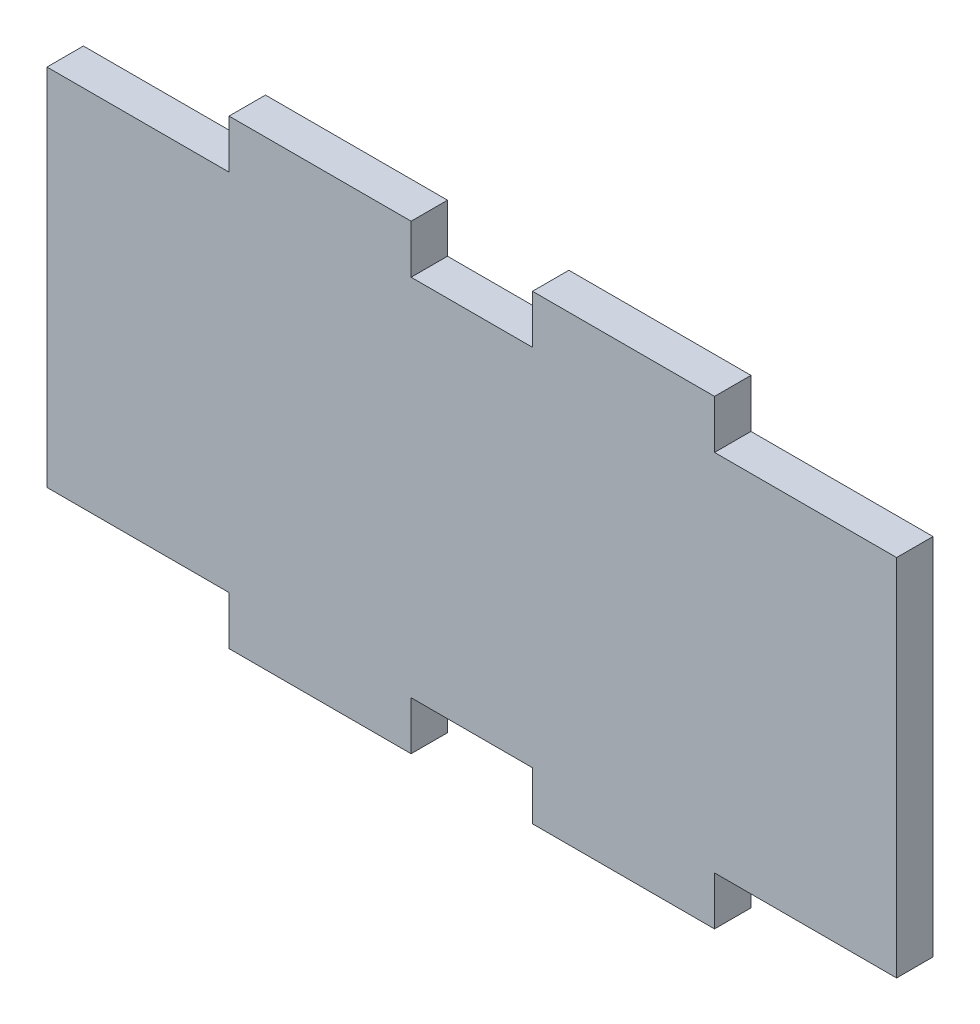
ISO-10303-21;
HEADER;
FILE_DESCRIPTION(('STEP AP214'),'2;1');
FILE_NAME('part.step','',(''),(''),'','','');
FILE_SCHEMA(('AUTOMOTIVE_DESIGN { 1 0 10303 214 1 1 1 1 }'));
ENDSEC;
DATA;
#1=APPLICATION_CONTEXT('core data for automotive mechanical design processes');
#2=APPLICATION_PROTOCOL_DEFINITION('international standard','automotive_design',2000,#1);
#3=PRODUCT_CONTEXT('',#1,'mechanical');
#4=PRODUCT('Part','Part','',(#3));
#5=PRODUCT_RELATED_PRODUCT_CATEGORY('part','',(#4));
#6=PRODUCT_DEFINITION_FORMATION('','',#4);
#7=PRODUCT_DEFINITION_CONTEXT('part definition',#1,'design');
#8=PRODUCT_DEFINITION('design','',#6,#7);
#9=PRODUCT_DEFINITION_SHAPE('','',#8);
#10=(LENGTH_UNIT() NAMED_UNIT(*) SI_UNIT(.MILLI.,.METRE.));
#11=(NAMED_UNIT(*) PLANE_ANGLE_UNIT() SI_UNIT($,.RADIAN.));
#12=(NAMED_UNIT(*) SI_UNIT($,.STERADIAN.) SOLID_ANGLE_UNIT());
#13=UNCERTAINTY_MEASURE_WITH_UNIT(LENGTH_MEASURE(1.E-05),#10,'distance_accuracy_value','');
#14=(GEOMETRIC_REPRESENTATION_CONTEXT(3) GLOBAL_UNCERTAINTY_ASSIGNED_CONTEXT((#13)) GLOBAL_UNIT_ASSIGNED_CONTEXT((#10,
#11,#12)) REPRESENTATION_CONTEXT('',''));
#15=CARTESIAN_POINT('',(0.,0.,0.));
#16=DIRECTION('',(0.,0.,1.));
#17=DIRECTION('',(1.,0.,0.));
#18=AXIS2_PLACEMENT_3D('',#15,#16,#17);
#19=CARTESIAN_POINT('',(0.,30.,3.));
#20=DIRECTION('',(0.,-1.,0.));
#21=DIRECTION('',(1.,0.,0.));
#22=AXIS2_PLACEMENT_3D('',#19,#20,#21);
#23=PLANE('',#22);
#24=DIRECTION('',(0.,0.,1.));
#25=VECTOR('',#24,1.);
#26=CARTESIAN_POINT('',(-30.,30.,0.));
#27=LINE('',#26,#25);
#28=CARTESIAN_POINT('',(-30.,30.,0.));
#29=VERTEX_POINT('',#28);
#30=CARTESIAN_POINT('',(-30.,30.,3.));
#31=VERTEX_POINT('',#30);
#32=EDGE_CURVE('E176',#29,#31,#27,.T.);
#33=ORIENTED_EDGE('',*,*,#32,.F.);
#34=DIRECTION('',(-1.,0.,0.));
#35=VECTOR('',#34,1.);
#36=CARTESIAN_POINT('',(0.,30.,0.));
#37=LINE('',#36,#35);
#38=CARTESIAN_POINT('',(-40.,30.,0.));
#39=VERTEX_POINT('',#38);
#40=EDGE_CURVE('E225',#29,#39,#37,.T.);
#41=ORIENTED_EDGE('',*,*,#40,.T.);
#42=DIRECTION('',(0.,0.,1.));
#43=VECTOR('',#42,1.);
#44=CARTESIAN_POINT('',(-40.,30.,0.));
#45=LINE('',#44,#43);
#46=CARTESIAN_POINT('',(-40.,30.,3.));
#47=VERTEX_POINT('',#46);
#48=EDGE_CURVE('E199',#39,#47,#45,.T.);
#49=ORIENTED_EDGE('',*,*,#48,.T.);
#50=DIRECTION('',(-1.,0.,0.));
#51=VECTOR('',#50,1.);
#52=CARTESIAN_POINT('',(0.,30.,3.));
#53=LINE('',#52,#51);
#54=EDGE_CURVE('E194',#31,#47,#53,.T.);
#55=ORIENTED_EDGE('',*,*,#54,.F.);
#56=EDGE_LOOP('',(#33,#41,#49,#55));
#57=FACE_BOUND('',#56,.T.);
#58=ADVANCED_FACE('F39',(#57),#23,.F.);
#59=DIRECTION('',(0.,0.,1.));
#60=VECTOR('',#59,1.);
#61=CARTESIAN_POINT('',(-55.,30.,0.));
#62=LINE('',#61,#60);
#63=CARTESIAN_POINT('',(-55.,30.,0.));
#64=VERTEX_POINT('',#63);
#65=CARTESIAN_POINT('',(-55.,30.,3.));
#66=VERTEX_POINT('',#65);
#67=EDGE_CURVE('E270',#64,#66,#62,.T.);
#68=ORIENTED_EDGE('',*,*,#67,.F.);
#69=CARTESIAN_POINT('',(-70.,30.,0.));
#70=VERTEX_POINT('',#69);
#71=EDGE_CURVE('E219',#64,#70,#37,.T.);
#72=ORIENTED_EDGE('',*,*,#71,.T.);
#73=DIRECTION('',(0.,0.,-1.));
#74=VECTOR('',#73,1.);
#75=CARTESIAN_POINT('',(-70.,30.,3.));
#76=LINE('',#75,#74);
#77=CARTESIAN_POINT('',(-70.,30.,3.));
#78=VERTEX_POINT('',#77);
#79=EDGE_CURVE('E47',#78,#70,#76,.T.);
#80=ORIENTED_EDGE('',*,*,#79,.F.);
#81=EDGE_CURVE('E201',#66,#78,#53,.T.);
#82=ORIENTED_EDGE('',*,*,#81,.F.);
#83=EDGE_LOOP('',(#68,#72,#80,#82));
#84=FACE_BOUND('',#83,.T.);
#85=ADVANCED_FACE('F269',(#84),#23,.F.);
#86=CARTESIAN_POINT('',(0.,0.,3.));
#87=DIRECTION('',(0.,1.,0.));
#88=DIRECTION('',(0.,0.,1.));
#89=AXIS2_PLACEMENT_3D('',#86,#87,#88);
#90=PLANE('',#89);
#91=DIRECTION('',(0.,0.,1.));
#92=VECTOR('',#91,1.);
#93=CARTESIAN_POINT('',(-40.,0.,0.));
#94=LINE('',#93,#92);
#95=CARTESIAN_POINT('',(-40.,0.,0.));
#96=VERTEX_POINT('',#95);
#97=CARTESIAN_POINT('',(-40.,0.,3.));
#98=VERTEX_POINT('',#97);
#99=EDGE_CURVE('E296',#96,#98,#94,.T.);
#100=ORIENTED_EDGE('',*,*,#99,.F.);
#101=DIRECTION('',(1.,0.,0.));
#102=VECTOR('',#101,1.);
#103=CARTESIAN_POINT('',(0.,0.,0.));
#104=LINE('',#103,#102);
#105=CARTESIAN_POINT('',(-30.,0.,0.));
#106=VERTEX_POINT('',#105);
#107=EDGE_CURVE('E231',#96,#106,#104,.T.);
#108=ORIENTED_EDGE('',*,*,#107,.T.);
#109=DIRECTION('',(0.,0.,1.));
#110=VECTOR('',#109,1.);
#111=CARTESIAN_POINT('',(-30.,0.,0.));
#112=LINE('',#111,#110);
#113=CARTESIAN_POINT('',(-30.,0.,3.));
#114=VERTEX_POINT('',#113);
#115=EDGE_CURVE('E300',#106,#114,#112,.T.);
#116=ORIENTED_EDGE('',*,*,#115,.T.);
#117=DIRECTION('',(1.,0.,0.));
#118=VECTOR('',#117,1.);
#119=CARTESIAN_POINT('',(0.,0.,3.));
#120=LINE('',#119,#118);
#121=EDGE_CURVE('E215',#98,#114,#120,.T.);
#122=ORIENTED_EDGE('',*,*,#121,.F.);
#123=EDGE_LOOP('',(#100,#108,#116,#122));
#124=FACE_BOUND('',#123,.T.);
#125=ADVANCED_FACE('F375',(#124),#90,.F.);
#126=DIRECTION('',(0.,0.,1.));
#127=VECTOR('',#126,1.);
#128=CARTESIAN_POINT('',(-15.,0.,0.));
#129=LINE('',#128,#127);
#130=CARTESIAN_POINT('',(-15.,0.,0.));
#131=VERTEX_POINT('',#130);
#132=CARTESIAN_POINT('',(-15.,0.,3.));
#133=VERTEX_POINT('',#132);
#134=EDGE_CURVE('E329',#131,#133,#129,.T.);
#135=ORIENTED_EDGE('',*,*,#134,.F.);
#136=CARTESIAN_POINT('',(0.,0.,0.));
#137=VERTEX_POINT('',#136);
#138=EDGE_CURVE('E227',#131,#137,#104,.T.);
#139=ORIENTED_EDGE('',*,*,#138,.T.);
#140=DIRECTION('',(0.,0.,-1.));
#141=VECTOR('',#140,1.);
#142=CARTESIAN_POINT('',(0.,0.,3.));
#143=LINE('',#142,#141);
#144=CARTESIAN_POINT('',(0.,0.,3.));
#145=VERTEX_POINT('',#144);
#146=EDGE_CURVE('E214',#145,#137,#143,.T.);
#147=ORIENTED_EDGE('',*,*,#146,.F.);
#148=EDGE_CURVE('E210',#133,#145,#120,.T.);
#149=ORIENTED_EDGE('',*,*,#148,.F.);
#150=EDGE_LOOP('',(#135,#139,#147,#149));
#151=FACE_BOUND('',#150,.T.);
#152=ADVANCED_FACE('F383',(#151),#90,.F.);
#153=CARTESIAN_POINT('',(0.,0.,3.));
#154=DIRECTION('',(-1.,0.,0.));
#155=DIRECTION('',(0.,0.,1.));
#156=AXIS2_PLACEMENT_3D('',#153,#154,#155);
#157=PLANE('',#156);
#158=DIRECTION('',(0.,1.,0.));
#159=VECTOR('',#158,1.);
#160=CARTESIAN_POINT('',(0.,0.,0.));
#161=LINE('',#160,#159);
#162=CARTESIAN_POINT('',(0.,30.,0.));
#163=VERTEX_POINT('',#162);
#164=EDGE_CURVE('E216',#137,#163,#161,.T.);
#165=ORIENTED_EDGE('',*,*,#164,.T.);
#166=DIRECTION('',(0.,0.,-1.));
#167=VECTOR('',#166,1.);
#168=CARTESIAN_POINT('',(0.,30.,3.));
#169=LINE('',#168,#167);
#170=CARTESIAN_POINT('',(0.,30.,3.));
#171=VERTEX_POINT('',#170);
#172=EDGE_CURVE('E11',#171,#163,#169,.T.);
#173=ORIENTED_EDGE('',*,*,#172,.F.);
#174=DIRECTION('',(0.,1.,0.));
#175=VECTOR('',#174,1.);
#176=CARTESIAN_POINT('',(0.,0.,3.));
#177=LINE('',#176,#175);
#178=EDGE_CURVE('E205',#145,#171,#177,.T.);
#179=ORIENTED_EDGE('',*,*,#178,.F.);
#180=ORIENTED_EDGE('',*,*,#146,.T.);
#181=EDGE_LOOP('',(#165,#173,#179,#180));
#182=FACE_BOUND('',#181,.T.);
#183=ADVANCED_FACE('F41',(#182),#157,.F.);
#184=CARTESIAN_POINT('',(-15.,30.,0.));
#185=VERTEX_POINT('',#184);
#186=EDGE_CURVE('E221',#163,#185,#37,.T.);
#187=ORIENTED_EDGE('',*,*,#186,.T.);
#188=DIRECTION('',(0.,0.,1.));
#189=VECTOR('',#188,1.);
#190=CARTESIAN_POINT('',(-15.,30.,0.));
#191=LINE('',#190,#189);
#192=CARTESIAN_POINT('',(-15.,30.,3.));
#193=VERTEX_POINT('',#192);
#194=EDGE_CURVE('E188',#185,#193,#191,.T.);
#195=ORIENTED_EDGE('',*,*,#194,.T.);
#196=EDGE_CURVE('E200',#171,#193,#53,.T.);
#197=ORIENTED_EDGE('',*,*,#196,.F.);
#198=ORIENTED_EDGE('',*,*,#172,.T.);
#199=EDGE_LOOP('',(#187,#195,#197,#198));
#200=FACE_BOUND('',#199,.T.);
#201=ADVANCED_FACE('F353',(#200),#23,.F.);
#202=CARTESIAN_POINT('',(-70.,0.,3.));
#203=DIRECTION('',(1.,0.,0.));
#204=DIRECTION('',(0.,0.,-1.));
#205=AXIS2_PLACEMENT_3D('',#202,#203,#204);
#206=PLANE('',#205);
#207=DIRECTION('',(0.,-1.,0.));
#208=VECTOR('',#207,1.);
#209=CARTESIAN_POINT('',(-70.,0.,0.));
#210=LINE('',#209,#208);
#211=CARTESIAN_POINT('',(-70.,0.,0.));
#212=VERTEX_POINT('',#211);
#213=EDGE_CURVE('E224',#70,#212,#210,.T.);
#214=ORIENTED_EDGE('',*,*,#213,.T.);
#215=DIRECTION('',(0.,0.,-1.));
#216=VECTOR('',#215,1.);
#217=CARTESIAN_POINT('',(-70.,0.,3.));
#218=LINE('',#217,#216);
#219=CARTESIAN_POINT('',(-70.,0.,3.));
#220=VERTEX_POINT('',#219);
#221=EDGE_CURVE('E234',#220,#212,#218,.T.);
#222=ORIENTED_EDGE('',*,*,#221,.F.);
#223=DIRECTION('',(0.,-1.,0.));
#224=VECTOR('',#223,1.);
#225=CARTESIAN_POINT('',(-70.,0.,3.));
#226=LINE('',#225,#224);
#227=EDGE_CURVE('E204',#78,#220,#226,.T.);
#228=ORIENTED_EDGE('',*,*,#227,.F.);
#229=ORIENTED_EDGE('',*,*,#79,.T.);
#230=EDGE_LOOP('',(#214,#222,#228,#229));
#231=FACE_BOUND('',#230,.T.);
#232=ADVANCED_FACE('F241',(#231),#206,.F.);
#233=CARTESIAN_POINT('',(-55.,0.,0.));
#234=VERTEX_POINT('',#233);
#235=EDGE_CURVE('E228',#212,#234,#104,.T.);
#236=ORIENTED_EDGE('',*,*,#235,.T.);
#237=DIRECTION('',(0.,0.,1.));
#238=VECTOR('',#237,1.);
#239=CARTESIAN_POINT('',(-55.,0.,0.));
#240=LINE('',#239,#238);
#241=CARTESIAN_POINT('',(-55.,0.,3.));
#242=VERTEX_POINT('',#241);
#243=EDGE_CURVE('E259',#234,#242,#240,.T.);
#244=ORIENTED_EDGE('',*,*,#243,.T.);
#245=EDGE_CURVE('E211',#220,#242,#120,.T.);
#246=ORIENTED_EDGE('',*,*,#245,.F.);
#247=ORIENTED_EDGE('',*,*,#221,.T.);
#248=EDGE_LOOP('',(#236,#244,#246,#247));
#249=FACE_BOUND('',#248,.T.);
#250=ADVANCED_FACE('F257',(#249),#90,.F.);
#251=CARTESIAN_POINT('',(0.,0.,3.));
#252=DIRECTION('',(0.,0.,1.));
#253=DIRECTION('',(1.,0.,0.));
#254=AXIS2_PLACEMENT_3D('',#251,#252,#253);
#255=PLANE('',#254);
#256=ORIENTED_EDGE('',*,*,#178,.T.);
#257=ORIENTED_EDGE('',*,*,#196,.T.);
#258=DIRECTION('',(0.,1.,0.));
#259=VECTOR('',#258,1.);
#260=CARTESIAN_POINT('',(-15.,34.,3.));
#261=LINE('',#260,#259);
#262=CARTESIAN_POINT('',(-15.,34.,3.));
#263=VERTEX_POINT('',#262);
#264=EDGE_CURVE('E62',#193,#263,#261,.T.);
#265=ORIENTED_EDGE('',*,*,#264,.T.);
#266=DIRECTION('',(-1.,0.,0.));
#267=VECTOR('',#266,1.);
#268=CARTESIAN_POINT('',(-15.,34.,3.));
#269=LINE('',#268,#267);
#270=CARTESIAN_POINT('',(-30.,34.,3.));
#271=VERTEX_POINT('',#270);
#272=EDGE_CURVE('E196',#263,#271,#269,.T.);
#273=ORIENTED_EDGE('',*,*,#272,.T.);
#274=DIRECTION('',(0.,-1.,0.));
#275=VECTOR('',#274,1.);
#276=CARTESIAN_POINT('',(-30.,34.,3.));
#277=LINE('',#276,#275);
#278=EDGE_CURVE('E179',#271,#31,#277,.T.);
#279=ORIENTED_EDGE('',*,*,#278,.T.);
#280=ORIENTED_EDGE('',*,*,#54,.T.);
#281=DIRECTION('',(0.,1.,0.));
#282=VECTOR('',#281,1.);
#283=CARTESIAN_POINT('',(-40.,34.,3.));
#284=LINE('',#283,#282);
#285=CARTESIAN_POINT('',(-40.,34.,3.));
#286=VERTEX_POINT('',#285);
#287=EDGE_CURVE('E54',#47,#286,#284,.T.);
#288=ORIENTED_EDGE('',*,*,#287,.T.);
#289=DIRECTION('',(-1.,0.,0.));
#290=VECTOR('',#289,1.);
#291=CARTESIAN_POINT('',(-40.,34.,3.));
#292=LINE('',#291,#290);
#293=CARTESIAN_POINT('',(-55.,34.,3.));
#294=VERTEX_POINT('',#293);
#295=EDGE_CURVE('E281',#286,#294,#292,.T.);
#296=ORIENTED_EDGE('',*,*,#295,.T.);
#297=DIRECTION('',(0.,-1.,0.));
#298=VECTOR('',#297,1.);
#299=CARTESIAN_POINT('',(-55.,34.,3.));
#300=LINE('',#299,#298);
#301=EDGE_CURVE('E267',#294,#66,#300,.T.);
#302=ORIENTED_EDGE('',*,*,#301,.T.);
#303=ORIENTED_EDGE('',*,*,#81,.T.);
#304=ORIENTED_EDGE('',*,*,#227,.T.);
#305=ORIENTED_EDGE('',*,*,#245,.T.);
#306=DIRECTION('',(0.,-1.,0.));
#307=VECTOR('',#306,1.);
#308=CARTESIAN_POINT('',(-55.,-4.,3.));
#309=LINE('',#308,#307);
#310=CARTESIAN_POINT('',(-55.,-4.,3.));
#311=VERTEX_POINT('',#310);
#312=EDGE_CURVE('E262',#242,#311,#309,.T.);
#313=ORIENTED_EDGE('',*,*,#312,.T.);
#314=DIRECTION('',(1.,0.,0.));
#315=VECTOR('',#314,1.);
#316=CARTESIAN_POINT('',(-40.,-4.,3.));
#317=LINE('',#316,#315);
#318=CARTESIAN_POINT('',(-40.,-4.,3.));
#319=VERTEX_POINT('',#318);
#320=EDGE_CURVE('E291',#311,#319,#317,.T.);
#321=ORIENTED_EDGE('',*,*,#320,.T.);
#322=DIRECTION('',(0.,1.,0.));
#323=VECTOR('',#322,1.);
#324=CARTESIAN_POINT('',(-40.,-4.,3.));
#325=LINE('',#324,#323);
#326=EDGE_CURVE('E297',#319,#98,#325,.T.);
#327=ORIENTED_EDGE('',*,*,#326,.T.);
#328=ORIENTED_EDGE('',*,*,#121,.T.);
#329=DIRECTION('',(0.,-1.,0.));
#330=VECTOR('',#329,1.);
#331=CARTESIAN_POINT('',(-30.,-4.,3.));
#332=LINE('',#331,#330);
#333=CARTESIAN_POINT('',(-30.,-4.,3.));
#334=VERTEX_POINT('',#333);
#335=EDGE_CURVE('E319',#114,#334,#332,.T.);
#336=ORIENTED_EDGE('',*,*,#335,.T.);
#337=DIRECTION('',(1.,0.,0.));
#338=VECTOR('',#337,1.);
#339=CARTESIAN_POINT('',(-15.,-4.,3.));
#340=LINE('',#339,#338);
#341=CARTESIAN_POINT('',(-15.,-4.,3.));
#342=VERTEX_POINT('',#341);
#343=EDGE_CURVE('E322',#334,#342,#340,.T.);
#344=ORIENTED_EDGE('',*,*,#343,.T.);
#345=DIRECTION('',(0.,1.,0.));
#346=VECTOR('',#345,1.);
#347=CARTESIAN_POINT('',(-15.,-4.,3.));
#348=LINE('',#347,#346);
#349=EDGE_CURVE('E312',#342,#133,#348,.T.);
#350=ORIENTED_EDGE('',*,*,#349,.T.);
#351=ORIENTED_EDGE('',*,*,#148,.T.);
#352=EDGE_LOOP('',(#256,#257,#265,#273,#279,#280,#288,#296,#302,#303,#304,#305,#313,#321,#327,
#328,#336,#344,#350,#351));
#353=FACE_BOUND('',#352,.T.);
#354=ADVANCED_FACE('F193',(#353),#255,.T.);
#355=CARTESIAN_POINT('',(0.,0.,0.));
#356=DIRECTION('',(0.,0.,1.));
#357=DIRECTION('',(1.,0.,0.));
#358=AXIS2_PLACEMENT_3D('',#355,#356,#357);
#359=PLANE('',#358);
#360=ORIENTED_EDGE('',*,*,#164,.F.);
#361=ORIENTED_EDGE('',*,*,#138,.F.);
#362=DIRECTION('',(0.,1.,0.));
#363=VECTOR('',#362,1.);
#364=CARTESIAN_POINT('',(-15.,-4.,0.));
#365=LINE('',#364,#363);
#366=CARTESIAN_POINT('',(-15.,-4.,0.));
#367=VERTEX_POINT('',#366);
#368=EDGE_CURVE('E316',#367,#131,#365,.T.);
#369=ORIENTED_EDGE('',*,*,#368,.F.);
#370=DIRECTION('',(1.,0.,0.));
#371=VECTOR('',#370,1.);
#372=CARTESIAN_POINT('',(-15.,-4.,0.));
#373=LINE('',#372,#371);
#374=CARTESIAN_POINT('',(-30.,-4.,0.));
#375=VERTEX_POINT('',#374);
#376=EDGE_CURVE('E313',#375,#367,#373,.T.);
#377=ORIENTED_EDGE('',*,*,#376,.F.);
#378=DIRECTION('',(0.,-1.,0.));
#379=VECTOR('',#378,1.);
#380=CARTESIAN_POINT('',(-30.,-4.,0.));
#381=LINE('',#380,#379);
#382=EDGE_CURVE('E309',#106,#375,#381,.T.);
#383=ORIENTED_EDGE('',*,*,#382,.F.);
#384=ORIENTED_EDGE('',*,*,#107,.F.);
#385=DIRECTION('',(0.,1.,0.));
#386=VECTOR('',#385,1.);
#387=CARTESIAN_POINT('',(-40.,-4.,0.));
#388=LINE('',#387,#386);
#389=CARTESIAN_POINT('',(-40.,-4.,0.));
#390=VERTEX_POINT('',#389);
#391=EDGE_CURVE('E289',#390,#96,#388,.T.);
#392=ORIENTED_EDGE('',*,*,#391,.F.);
#393=DIRECTION('',(1.,0.,0.));
#394=VECTOR('',#393,1.);
#395=CARTESIAN_POINT('',(-40.,-4.,0.));
#396=LINE('',#395,#394);
#397=CARTESIAN_POINT('',(-55.,-4.,0.));
#398=VERTEX_POINT('',#397);
#399=EDGE_CURVE('E293',#398,#390,#396,.T.);
#400=ORIENTED_EDGE('',*,*,#399,.F.);
#401=DIRECTION('',(0.,-1.,0.));
#402=VECTOR('',#401,1.);
#403=CARTESIAN_POINT('',(-55.,-4.,0.));
#404=LINE('',#403,#402);
#405=EDGE_CURVE('E254',#234,#398,#404,.T.);
#406=ORIENTED_EDGE('',*,*,#405,.F.);
#407=ORIENTED_EDGE('',*,*,#235,.F.);
#408=ORIENTED_EDGE('',*,*,#213,.F.);
#409=ORIENTED_EDGE('',*,*,#71,.F.);
#410=DIRECTION('',(0.,-1.,0.));
#411=VECTOR('',#410,1.);
#412=CARTESIAN_POINT('',(-55.,34.,0.));
#413=LINE('',#412,#411);
#414=CARTESIAN_POINT('',(-55.,34.,0.));
#415=VERTEX_POINT('',#414);
#416=EDGE_CURVE('E285',#415,#64,#413,.T.);
#417=ORIENTED_EDGE('',*,*,#416,.F.);
#418=DIRECTION('',(-1.,0.,0.));
#419=VECTOR('',#418,1.);
#420=CARTESIAN_POINT('',(-40.,34.,0.));
#421=LINE('',#420,#419);
#422=CARTESIAN_POINT('',(-40.,34.,0.));
#423=VERTEX_POINT('',#422);
#424=EDGE_CURVE('E279',#423,#415,#421,.T.);
#425=ORIENTED_EDGE('',*,*,#424,.F.);
#426=DIRECTION('',(0.,1.,0.));
#427=VECTOR('',#426,1.);
#428=CARTESIAN_POINT('',(-40.,34.,0.));
#429=LINE('',#428,#427);
#430=EDGE_CURVE('E275',#39,#423,#429,.T.);
#431=ORIENTED_EDGE('',*,*,#430,.F.);
#432=ORIENTED_EDGE('',*,*,#40,.F.);
#433=DIRECTION('',(0.,-1.,0.));
#434=VECTOR('',#433,1.);
#435=CARTESIAN_POINT('',(-30.,34.,0.));
#436=LINE('',#435,#434);
#437=CARTESIAN_POINT('',(-30.,34.,0.));
#438=VERTEX_POINT('',#437);
#439=EDGE_CURVE('E182',#438,#29,#436,.T.);
#440=ORIENTED_EDGE('',*,*,#439,.F.);
#441=DIRECTION('',(-1.,0.,0.));
#442=VECTOR('',#441,1.);
#443=CARTESIAN_POINT('',(-15.,34.,0.));
#444=LINE('',#443,#442);
#445=CARTESIAN_POINT('',(-15.,34.,0.));
#446=VERTEX_POINT('',#445);
#447=EDGE_CURVE('E336',#446,#438,#444,.T.);
#448=ORIENTED_EDGE('',*,*,#447,.F.);
#449=DIRECTION('',(0.,1.,0.));
#450=VECTOR('',#449,1.);
#451=CARTESIAN_POINT('',(-15.,34.,0.));
#452=LINE('',#451,#450);
#453=EDGE_CURVE('E197',#185,#446,#452,.T.);
#454=ORIENTED_EDGE('',*,*,#453,.F.);
#455=ORIENTED_EDGE('',*,*,#186,.F.);
#456=EDGE_LOOP('',(#360,#361,#369,#377,#383,#384,#392,#400,#406,#407,#408,#409,#417,#425,#431,
#432,#440,#448,#454,#455));
#457=FACE_BOUND('',#456,.T.);
#458=ADVANCED_FACE('F249',(#457),#359,.F.);
#459=CARTESIAN_POINT('',(-30.,-4.,0.));
#460=DIRECTION('',(-1.,0.,0.));
#461=DIRECTION('',(0.,0.,1.));
#462=AXIS2_PLACEMENT_3D('',#459,#460,#461);
#463=PLANE('',#462);
#464=ORIENTED_EDGE('',*,*,#335,.F.);
#465=ORIENTED_EDGE('',*,*,#115,.F.);
#466=ORIENTED_EDGE('',*,*,#382,.T.);
#467=DIRECTION('',(0.,0.,1.));
#468=VECTOR('',#467,1.);
#469=CARTESIAN_POINT('',(-30.,-4.,0.));
#470=LINE('',#469,#468);
#471=EDGE_CURVE('E318',#375,#334,#470,.T.);
#472=ORIENTED_EDGE('',*,*,#471,.T.);
#473=EDGE_LOOP('',(#464,#465,#466,#472));
#474=FACE_BOUND('',#473,.T.);
#475=ADVANCED_FACE('F403',(#474),#463,.T.);
#476=CARTESIAN_POINT('',(-15.,-4.,0.));
#477=DIRECTION('',(1.,0.,0.));
#478=DIRECTION('',(0.,0.,-1.));
#479=AXIS2_PLACEMENT_3D('',#476,#477,#478);
#480=PLANE('',#479);
#481=ORIENTED_EDGE('',*,*,#349,.F.);
#482=DIRECTION('',(0.,0.,1.));
#483=VECTOR('',#482,1.);
#484=CARTESIAN_POINT('',(-15.,-4.,0.));
#485=LINE('',#484,#483);
#486=EDGE_CURVE('E331',#367,#342,#485,.T.);
#487=ORIENTED_EDGE('',*,*,#486,.F.);
#488=ORIENTED_EDGE('',*,*,#368,.T.);
#489=ORIENTED_EDGE('',*,*,#134,.T.);
#490=EDGE_LOOP('',(#481,#487,#488,#489));
#491=FACE_BOUND('',#490,.T.);
#492=ADVANCED_FACE('F409',(#491),#480,.T.);
#493=CARTESIAN_POINT('',(-15.,-4.,0.));
#494=DIRECTION('',(0.,-1.,0.));
#495=DIRECTION('',(1.,0.,0.));
#496=AXIS2_PLACEMENT_3D('',#493,#494,#495);
#497=PLANE('',#496);
#498=ORIENTED_EDGE('',*,*,#343,.F.);
#499=ORIENTED_EDGE('',*,*,#471,.F.);
#500=ORIENTED_EDGE('',*,*,#376,.T.);
#501=ORIENTED_EDGE('',*,*,#486,.T.);
#502=EDGE_LOOP('',(#498,#499,#500,#501));
#503=FACE_BOUND('',#502,.T.);
#504=ADVANCED_FACE('F411',(#503),#497,.T.);
#505=CARTESIAN_POINT('',(-40.,-4.,0.));
#506=DIRECTION('',(1.,0.,0.));
#507=DIRECTION('',(0.,0.,-1.));
#508=AXIS2_PLACEMENT_3D('',#505,#506,#507);
#509=PLANE('',#508);
#510=ORIENTED_EDGE('',*,*,#326,.F.);
#511=DIRECTION('',(0.,0.,1.));
#512=VECTOR('',#511,1.);
#513=CARTESIAN_POINT('',(-40.,-4.,0.));
#514=LINE('',#513,#512);
#515=EDGE_CURVE('E303',#390,#319,#514,.T.);
#516=ORIENTED_EDGE('',*,*,#515,.F.);
#517=ORIENTED_EDGE('',*,*,#391,.T.);
#518=ORIENTED_EDGE('',*,*,#99,.T.);
#519=EDGE_LOOP('',(#510,#516,#517,#518));
#520=FACE_BOUND('',#519,.T.);
#521=ADVANCED_FACE('F413',(#520),#509,.T.);
#522=CARTESIAN_POINT('',(-40.,-4.,0.));
#523=DIRECTION('',(0.,-1.,0.));
#524=DIRECTION('',(0.,0.,-1.));
#525=AXIS2_PLACEMENT_3D('',#522,#523,#524);
#526=PLANE('',#525);
#527=ORIENTED_EDGE('',*,*,#320,.F.);
#528=DIRECTION('',(0.,0.,1.));
#529=VECTOR('',#528,1.);
#530=CARTESIAN_POINT('',(-55.,-4.,0.));
#531=LINE('',#530,#529);
#532=EDGE_CURVE('E305',#398,#311,#531,.T.);
#533=ORIENTED_EDGE('',*,*,#532,.F.);
#534=ORIENTED_EDGE('',*,*,#399,.T.);
#535=ORIENTED_EDGE('',*,*,#515,.T.);
#536=EDGE_LOOP('',(#527,#533,#534,#535));
#537=FACE_BOUND('',#536,.T.);
#538=ADVANCED_FACE('F419',(#537),#526,.T.);
#539=CARTESIAN_POINT('',(-55.,-4.,0.));
#540=DIRECTION('',(-1.,0.,0.));
#541=DIRECTION('',(0.,0.,1.));
#542=AXIS2_PLACEMENT_3D('',#539,#540,#541);
#543=PLANE('',#542);
#544=ORIENTED_EDGE('',*,*,#312,.F.);
#545=ORIENTED_EDGE('',*,*,#243,.F.);
#546=ORIENTED_EDGE('',*,*,#405,.T.);
#547=ORIENTED_EDGE('',*,*,#532,.T.);
#548=EDGE_LOOP('',(#544,#545,#546,#547));
#549=FACE_BOUND('',#548,.T.);
#550=ADVANCED_FACE('F426',(#549),#543,.T.);
#551=CARTESIAN_POINT('',(-40.,34.,0.));
#552=DIRECTION('',(0.,1.,0.));
#553=DIRECTION('',(0.,0.,1.));
#554=AXIS2_PLACEMENT_3D('',#551,#552,#553);
#555=PLANE('',#554);
#556=ORIENTED_EDGE('',*,*,#295,.F.);
#557=DIRECTION('',(0.,0.,1.));
#558=VECTOR('',#557,1.);
#559=CARTESIAN_POINT('',(-40.,34.,0.));
#560=LINE('',#559,#558);
#561=EDGE_CURVE('E220',#423,#286,#560,.T.);
#562=ORIENTED_EDGE('',*,*,#561,.F.);
#563=ORIENTED_EDGE('',*,*,#424,.T.);
#564=DIRECTION('',(0.,0.,1.));
#565=VECTOR('',#564,1.);
#566=CARTESIAN_POINT('',(-55.,34.,0.));
#567=LINE('',#566,#565);
#568=EDGE_CURVE('E272',#415,#294,#567,.T.);
#569=ORIENTED_EDGE('',*,*,#568,.T.);
#570=EDGE_LOOP('',(#556,#562,#563,#569));
#571=FACE_BOUND('',#570,.T.);
#572=ADVANCED_FACE('F359',(#571),#555,.T.);
#573=CARTESIAN_POINT('',(-40.,34.,0.));
#574=DIRECTION('',(1.,0.,0.));
#575=DIRECTION('',(0.,0.,-1.));
#576=AXIS2_PLACEMENT_3D('',#573,#574,#575);
#577=PLANE('',#576);
#578=ORIENTED_EDGE('',*,*,#287,.F.);
#579=ORIENTED_EDGE('',*,*,#48,.F.);
#580=ORIENTED_EDGE('',*,*,#430,.T.);
#581=ORIENTED_EDGE('',*,*,#561,.T.);
#582=EDGE_LOOP('',(#578,#579,#580,#581));
#583=FACE_BOUND('',#582,.T.);
#584=ADVANCED_FACE('F356',(#583),#577,.T.);
#585=CARTESIAN_POINT('',(-55.,34.,0.));
#586=DIRECTION('',(-1.,0.,0.));
#587=DIRECTION('',(0.,0.,1.));
#588=AXIS2_PLACEMENT_3D('',#585,#586,#587);
#589=PLANE('',#588);
#590=ORIENTED_EDGE('',*,*,#301,.F.);
#591=ORIENTED_EDGE('',*,*,#568,.F.);
#592=ORIENTED_EDGE('',*,*,#416,.T.);
#593=ORIENTED_EDGE('',*,*,#67,.T.);
#594=EDGE_LOOP('',(#590,#591,#592,#593));
#595=FACE_BOUND('',#594,.T.);
#596=ADVANCED_FACE('F360',(#595),#589,.T.);
#597=CARTESIAN_POINT('',(-15.,34.,0.));
#598=DIRECTION('',(1.,0.,0.));
#599=DIRECTION('',(0.,0.,-1.));
#600=AXIS2_PLACEMENT_3D('',#597,#598,#599);
#601=PLANE('',#600);
#602=ORIENTED_EDGE('',*,*,#264,.F.);
#603=ORIENTED_EDGE('',*,*,#194,.F.);
#604=ORIENTED_EDGE('',*,*,#453,.T.);
#605=DIRECTION('',(0.,0.,1.));
#606=VECTOR('',#605,1.);
#607=CARTESIAN_POINT('',(-15.,34.,0.));
#608=LINE('',#607,#606);
#609=EDGE_CURVE('E340',#446,#263,#608,.T.);
#610=ORIENTED_EDGE('',*,*,#609,.T.);
#611=EDGE_LOOP('',(#602,#603,#604,#610));
#612=FACE_BOUND('',#611,.T.);
#613=ADVANCED_FACE('F345',(#612),#601,.T.);
#614=CARTESIAN_POINT('',(-30.,34.,0.));
#615=DIRECTION('',(-1.,0.,0.));
#616=DIRECTION('',(0.,0.,1.));
#617=AXIS2_PLACEMENT_3D('',#614,#615,#616);
#618=PLANE('',#617);
#619=ORIENTED_EDGE('',*,*,#278,.F.);
#620=DIRECTION('',(0.,0.,1.));
#621=VECTOR('',#620,1.);
#622=CARTESIAN_POINT('',(-30.,34.,0.));
#623=LINE('',#622,#621);
#624=EDGE_CURVE('E187',#438,#271,#623,.T.);
#625=ORIENTED_EDGE('',*,*,#624,.F.);
#626=ORIENTED_EDGE('',*,*,#439,.T.);
#627=ORIENTED_EDGE('',*,*,#32,.T.);
#628=EDGE_LOOP('',(#619,#625,#626,#627));
#629=FACE_BOUND('',#628,.T.);
#630=ADVANCED_FACE('F178',(#629),#618,.T.);
#631=CARTESIAN_POINT('',(-15.,34.,0.));
#632=DIRECTION('',(0.,1.,0.));
#633=DIRECTION('',(-1.,0.,0.));
#634=AXIS2_PLACEMENT_3D('',#631,#632,#633);
#635=PLANE('',#634);
#636=ORIENTED_EDGE('',*,*,#272,.F.);
#637=ORIENTED_EDGE('',*,*,#609,.F.);
#638=ORIENTED_EDGE('',*,*,#447,.T.);
#639=ORIENTED_EDGE('',*,*,#624,.T.);
#640=EDGE_LOOP('',(#636,#637,#638,#639));
#641=FACE_BOUND('',#640,.T.);
#642=ADVANCED_FACE('F349',(#641),#635,.T.);
#643=CLOSED_SHELL('',(#58,#85,#125,#152,#183,#201,#232,#250,#354,#458,#475,#492,#504,#521,#538,
#550,#572,#584,#596,#613,#630,#642));
#644=MANIFOLD_SOLID_BREP('B2',#643);
#645=ADVANCED_BREP_SHAPE_REPRESENTATION('',(#18,#644),#14);
#646=SHAPE_DEFINITION_REPRESENTATION(#9,#645);
ENDSEC;
END-ISO-10303-21;
